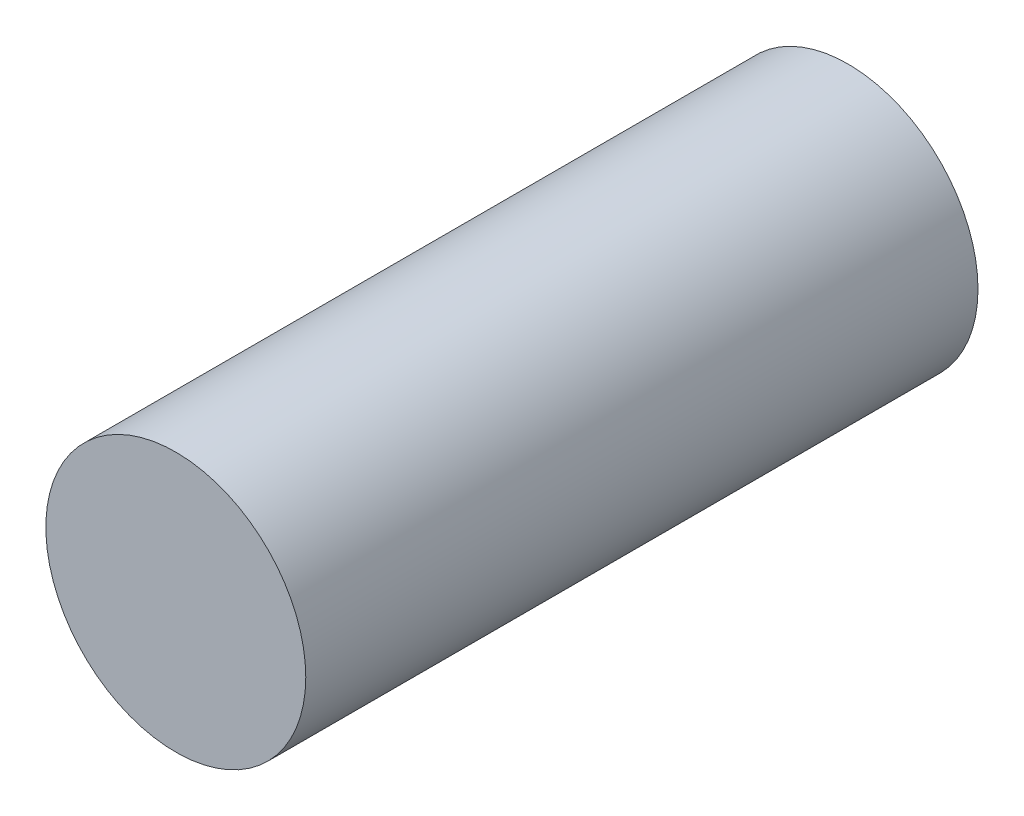
ISO-10303-21;
HEADER;
FILE_DESCRIPTION(('STEP AP214'),'2;1');
FILE_NAME('part.step','',(''),(''),'','','');
FILE_SCHEMA(('AUTOMOTIVE_DESIGN { 1 0 10303 214 1 1 1 1 }'));
ENDSEC;
DATA;
#1=APPLICATION_CONTEXT('core data for automotive mechanical design processes');
#2=APPLICATION_PROTOCOL_DEFINITION('international standard','automotive_design',2000,#1);
#3=PRODUCT_CONTEXT('',#1,'mechanical');
#4=PRODUCT('Part','Part','',(#3));
#5=PRODUCT_RELATED_PRODUCT_CATEGORY('part','',(#4));
#6=PRODUCT_DEFINITION_FORMATION('','',#4);
#7=PRODUCT_DEFINITION_CONTEXT('part definition',#1,'design');
#8=PRODUCT_DEFINITION('design','',#6,#7);
#9=PRODUCT_DEFINITION_SHAPE('','',#8);
#10=(LENGTH_UNIT() NAMED_UNIT(*) SI_UNIT(.MILLI.,.METRE.));
#11=(NAMED_UNIT(*) PLANE_ANGLE_UNIT() SI_UNIT($,.RADIAN.));
#12=(NAMED_UNIT(*) SI_UNIT($,.STERADIAN.) SOLID_ANGLE_UNIT());
#13=UNCERTAINTY_MEASURE_WITH_UNIT(LENGTH_MEASURE(1.E-05),#10,'distance_accuracy_value','');
#14=(GEOMETRIC_REPRESENTATION_CONTEXT(3) GLOBAL_UNCERTAINTY_ASSIGNED_CONTEXT((#13)) GLOBAL_UNIT_ASSIGNED_CONTEXT((#10,
#11,#12)) REPRESENTATION_CONTEXT('',''));
#15=CARTESIAN_POINT('',(0.,0.,0.));
#16=DIRECTION('',(0.,0.,1.));
#17=DIRECTION('',(1.,0.,0.));
#18=AXIS2_PLACEMENT_3D('',#15,#16,#17);
#19=CARTESIAN_POINT('',(0.,0.,150.));
#20=DIRECTION('',(0.,0.,-1.));
#21=DIRECTION('',(-1.,0.,0.));
#22=AXIS2_PLACEMENT_3D('',#19,#20,#21);
#23=CYLINDRICAL_SURFACE('',#22,55.5);
#24=CARTESIAN_POINT('',(0.,0.,-150.));
#25=DIRECTION('',(0.,0.,1.));
#26=DIRECTION('',(1.,0.,0.));
#27=AXIS2_PLACEMENT_3D('',#24,#25,#26);
#28=CIRCLE('',#27,55.5);
#29=CARTESIAN_POINT('',(55.5,0.,-150.));
#30=VERTEX_POINT('',#29);
#31=EDGE_CURVE('E52',#30,#30,#28,.T.);
#32=ORIENTED_EDGE('',*,*,#31,.F.);
#33=EDGE_LOOP('',(#32));
#34=FACE_BOUND('',#33,.T.);
#35=CARTESIAN_POINT('',(0.,0.,140.));
#36=DIRECTION('',(0.,0.,1.));
#37=DIRECTION('',(1.,0.,0.));
#38=AXIS2_PLACEMENT_3D('',#35,#36,#37);
#39=CIRCLE('',#38,55.5);
#40=CARTESIAN_POINT('',(55.5,0.,140.));
#41=VERTEX_POINT('',#40);
#42=EDGE_CURVE('E43',#41,#41,#39,.T.);
#43=ORIENTED_EDGE('',*,*,#42,.T.);
#44=EDGE_LOOP('',(#43));
#45=FACE_BOUND('',#44,.T.);
#46=ADVANCED_FACE('F39',(#34,#45),#23,.F.);
#47=CARTESIAN_POINT('',(0.,0.,150.));
#48=DIRECTION('',(0.,0.,1.));
#49=DIRECTION('',(1.,0.,0.));
#50=AXIS2_PLACEMENT_3D('',#47,#48,#49);
#51=PLANE('',#50);
#52=CARTESIAN_POINT('',(0.,0.,150.));
#53=DIRECTION('',(0.,0.,1.));
#54=DIRECTION('',(1.,0.,0.));
#55=AXIS2_PLACEMENT_3D('',#52,#53,#54);
#56=CIRCLE('',#55,58.);
#57=CARTESIAN_POINT('',(58.,0.,150.));
#58=VERTEX_POINT('',#57);
#59=EDGE_CURVE('E10',#58,#58,#56,.T.);
#60=ORIENTED_EDGE('',*,*,#59,.T.);
#61=EDGE_LOOP('',(#60));
#62=FACE_BOUND('',#61,.T.);
#63=ADVANCED_FACE('F71',(#62),#51,.T.);
#64=CARTESIAN_POINT('',(0.,0.,-150.));
#65=DIRECTION('',(0.,0.,1.));
#66=DIRECTION('',(1.,0.,0.));
#67=AXIS2_PLACEMENT_3D('',#64,#65,#66);
#68=PLANE('',#67);
#69=CARTESIAN_POINT('',(0.,0.,-150.));
#70=DIRECTION('',(0.,0.,1.));
#71=DIRECTION('',(1.,0.,0.));
#72=AXIS2_PLACEMENT_3D('',#69,#70,#71);
#73=CIRCLE('',#72,58.);
#74=CARTESIAN_POINT('',(58.,0.,-150.));
#75=VERTEX_POINT('',#74);
#76=EDGE_CURVE('E47',#75,#75,#73,.T.);
#77=ORIENTED_EDGE('',*,*,#76,.F.);
#78=EDGE_LOOP('',(#77));
#79=FACE_BOUND('',#78,.T.);
#80=ORIENTED_EDGE('',*,*,#31,.T.);
#81=EDGE_LOOP('',(#80));
#82=FACE_BOUND('',#81,.T.);
#83=ADVANCED_FACE('F67',(#79,#82),#68,.F.);
#84=CARTESIAN_POINT('',(0.,0.,150.));
#85=DIRECTION('',(0.,0.,-1.));
#86=DIRECTION('',(-1.,0.,0.));
#87=AXIS2_PLACEMENT_3D('',#84,#85,#86);
#88=CYLINDRICAL_SURFACE('',#87,58.);
#89=ORIENTED_EDGE('',*,*,#59,.F.);
#90=EDGE_LOOP('',(#89));
#91=FACE_BOUND('',#90,.T.);
#92=ORIENTED_EDGE('',*,*,#76,.T.);
#93=EDGE_LOOP('',(#92));
#94=FACE_BOUND('',#93,.T.);
#95=ADVANCED_FACE('F41',(#91,#94),#88,.T.);
#96=CARTESIAN_POINT('',(0.,0.,140.));
#97=DIRECTION('',(0.,0.,1.));
#98=DIRECTION('',(1.,0.,0.));
#99=AXIS2_PLACEMENT_3D('',#96,#97,#98);
#100=PLANE('',#99);
#101=ORIENTED_EDGE('',*,*,#42,.F.);
#102=EDGE_LOOP('',(#101));
#103=FACE_BOUND('',#102,.T.);
#104=ADVANCED_FACE('F61',(#103),#100,.F.);
#105=CLOSED_SHELL('',(#46,#63,#83,#95,#104));
#106=MANIFOLD_SOLID_BREP('B2',#105);
#107=ADVANCED_BREP_SHAPE_REPRESENTATION('',(#18,#106),#14);
#108=SHAPE_DEFINITION_REPRESENTATION(#9,#107);
ENDSEC;
END-ISO-10303-21;
